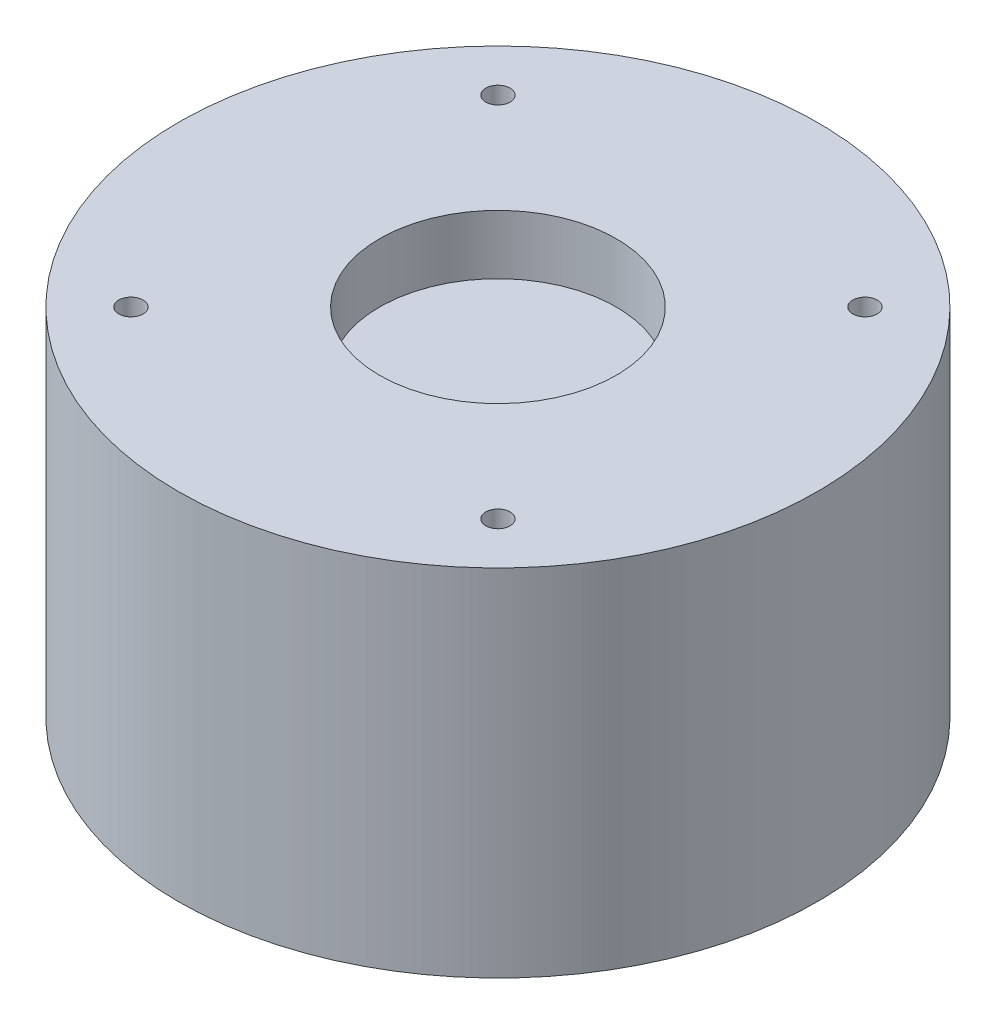
ISO-10303-21;
HEADER;
FILE_DESCRIPTION(('STEP AP214'),'2;1');
FILE_NAME('part.step','',(''),(''),'','','');
FILE_SCHEMA(('AUTOMOTIVE_DESIGN { 1 0 10303 214 1 1 1 1 }'));
ENDSEC;
DATA;
#1=APPLICATION_CONTEXT('core data for automotive mechanical design processes');
#2=APPLICATION_PROTOCOL_DEFINITION('international standard','automotive_design',2000,#1);
#3=PRODUCT_CONTEXT('',#1,'mechanical');
#4=PRODUCT('Part','Part','',(#3));
#5=PRODUCT_RELATED_PRODUCT_CATEGORY('part','',(#4));
#6=PRODUCT_DEFINITION_FORMATION('','',#4);
#7=PRODUCT_DEFINITION_CONTEXT('part definition',#1,'design');
#8=PRODUCT_DEFINITION('design','',#6,#7);
#9=PRODUCT_DEFINITION_SHAPE('','',#8);
#10=(LENGTH_UNIT() NAMED_UNIT(*) SI_UNIT(.MILLI.,.METRE.));
#11=(NAMED_UNIT(*) PLANE_ANGLE_UNIT() SI_UNIT($,.RADIAN.));
#12=(NAMED_UNIT(*) SI_UNIT($,.STERADIAN.) SOLID_ANGLE_UNIT());
#13=UNCERTAINTY_MEASURE_WITH_UNIT(LENGTH_MEASURE(1.E-05),#10,'distance_accuracy_value','');
#14=(GEOMETRIC_REPRESENTATION_CONTEXT(3) GLOBAL_UNCERTAINTY_ASSIGNED_CONTEXT((#13)) GLOBAL_UNIT_ASSIGNED_CONTEXT((#10,
#11,#12)) REPRESENTATION_CONTEXT('',''));
#15=CARTESIAN_POINT('',(0.,0.,0.));
#16=DIRECTION('',(0.,0.,1.));
#17=DIRECTION('',(1.,0.,0.));
#18=AXIS2_PLACEMENT_3D('',#15,#16,#17);
#19=CARTESIAN_POINT('',(0.,30.,0.));
#20=DIRECTION('',(0.,-1.,0.));
#21=DIRECTION('',(0.,0.,-1.));
#22=AXIS2_PLACEMENT_3D('',#19,#20,#21);
#23=CYLINDRICAL_SURFACE('',#22,27.);
#24=CARTESIAN_POINT('',(0.,30.,0.));
#25=DIRECTION('',(0.,1.,0.));
#26=DIRECTION('',(0.,0.,1.));
#27=AXIS2_PLACEMENT_3D('',#24,#25,#26);
#28=CIRCLE('',#27,27.);
#29=CARTESIAN_POINT('',(0.,30.,27.));
#30=VERTEX_POINT('',#29);
#31=EDGE_CURVE('E10',#30,#30,#28,.T.);
#32=ORIENTED_EDGE('',*,*,#31,.F.);
#33=EDGE_LOOP('',(#32));
#34=FACE_BOUND('',#33,.T.);
#35=CARTESIAN_POINT('',(0.,0.,0.));
#36=DIRECTION('',(0.,1.,0.));
#37=DIRECTION('',(0.,0.,1.));
#38=AXIS2_PLACEMENT_3D('',#35,#36,#37);
#39=CIRCLE('',#38,27.);
#40=CARTESIAN_POINT('',(0.,0.,27.));
#41=VERTEX_POINT('',#40);
#42=EDGE_CURVE('E44',#41,#41,#39,.T.);
#43=ORIENTED_EDGE('',*,*,#42,.T.);
#44=EDGE_LOOP('',(#43));
#45=FACE_BOUND('',#44,.T.);
#46=ADVANCED_FACE('F41',(#34,#45),#23,.T.);
#47=CARTESIAN_POINT('',(0.,30.,0.));
#48=DIRECTION('',(0.,1.,0.));
#49=DIRECTION('',(0.,0.,1.));
#50=AXIS2_PLACEMENT_3D('',#47,#48,#49);
#51=PLANE('',#50);
#52=CARTESIAN_POINT('',(0.,30.,0.));
#53=DIRECTION('',(0.,1.,0.));
#54=DIRECTION('',(0.,0.,1.));
#55=AXIS2_PLACEMENT_3D('',#52,#53,#54);
#56=CIRCLE('',#55,10.);
#57=CARTESIAN_POINT('',(0.,30.,10.));
#58=VERTEX_POINT('',#57);
#59=EDGE_CURVE('E95',#58,#58,#56,.T.);
#60=ORIENTED_EDGE('',*,*,#59,.F.);
#61=EDGE_LOOP('',(#60));
#62=FACE_BOUND('',#61,.T.);
#63=CARTESIAN_POINT('',(-15.5,30.,-15.5));
#64=DIRECTION('',(0.,-1.,0.));
#65=DIRECTION('',(0.,0.,-1.));
#66=AXIS2_PLACEMENT_3D('',#63,#64,#65);
#67=CIRCLE('',#66,1.02499999999999);
#68=CARTESIAN_POINT('',(-15.5,30.,-16.525));
#69=VERTEX_POINT('',#68);
#70=EDGE_CURVE('E78',#69,#69,#67,.T.);
#71=ORIENTED_EDGE('',*,*,#70,.T.);
#72=EDGE_LOOP('',(#71));
#73=FACE_BOUND('',#72,.T.);
#74=CARTESIAN_POINT('',(15.5,30.,-15.5));
#75=DIRECTION('',(0.,-1.,0.));
#76=DIRECTION('',(0.,0.,-1.));
#77=AXIS2_PLACEMENT_3D('',#74,#75,#76);
#78=CIRCLE('',#77,1.02499999999999);
#79=CARTESIAN_POINT('',(15.5,30.,-16.525));
#80=VERTEX_POINT('',#79);
#81=EDGE_CURVE('E70',#80,#80,#78,.T.);
#82=ORIENTED_EDGE('',*,*,#81,.T.);
#83=EDGE_LOOP('',(#82));
#84=FACE_BOUND('',#83,.T.);
#85=CARTESIAN_POINT('',(15.5,30.,15.5));
#86=DIRECTION('',(0.,-1.,0.));
#87=DIRECTION('',(0.,0.,-1.));
#88=AXIS2_PLACEMENT_3D('',#85,#86,#87);
#89=CIRCLE('',#88,1.02499999999999);
#90=CARTESIAN_POINT('',(15.5,30.,14.475));
#91=VERTEX_POINT('',#90);
#92=EDGE_CURVE('E62',#91,#91,#89,.T.);
#93=ORIENTED_EDGE('',*,*,#92,.T.);
#94=EDGE_LOOP('',(#93));
#95=FACE_BOUND('',#94,.T.);
#96=CARTESIAN_POINT('',(-15.5,30.,15.5));
#97=DIRECTION('',(0.,-1.,0.));
#98=DIRECTION('',(0.,0.,-1.));
#99=AXIS2_PLACEMENT_3D('',#96,#97,#98);
#100=CIRCLE('',#99,1.02499999999999);
#101=CARTESIAN_POINT('',(-15.5,30.,14.475));
#102=VERTEX_POINT('',#101);
#103=EDGE_CURVE('E53',#102,#102,#100,.T.);
#104=ORIENTED_EDGE('',*,*,#103,.T.);
#105=EDGE_LOOP('',(#104));
#106=FACE_BOUND('',#105,.T.);
#107=ORIENTED_EDGE('',*,*,#31,.T.);
#108=EDGE_LOOP('',(#107));
#109=FACE_BOUND('',#108,.T.);
#110=ADVANCED_FACE('F112',(#62,#73,#84,#95,#106,#109),#51,.T.);
#111=CARTESIAN_POINT('',(0.,0.,0.));
#112=DIRECTION('',(0.,1.,0.));
#113=DIRECTION('',(0.,0.,1.));
#114=AXIS2_PLACEMENT_3D('',#111,#112,#113);
#115=PLANE('',#114);
#116=CARTESIAN_POINT('',(0.,0.,0.));
#117=DIRECTION('',(0.,-1.,0.));
#118=DIRECTION('',(0.,0.,-1.));
#119=AXIS2_PLACEMENT_3D('',#116,#117,#118);
#120=CIRCLE('',#119,2.5);
#121=CARTESIAN_POINT('',(0.,0.,-2.5));
#122=VERTEX_POINT('',#121);
#123=EDGE_CURVE('E87',#122,#122,#120,.T.);
#124=ORIENTED_EDGE('',*,*,#123,.F.);
#125=EDGE_LOOP('',(#124));
#126=FACE_BOUND('',#125,.T.);
#127=CARTESIAN_POINT('',(-15.5,0.,-15.5));
#128=DIRECTION('',(0.,-1.,0.));
#129=DIRECTION('',(0.,0.,-1.));
#130=AXIS2_PLACEMENT_3D('',#127,#128,#129);
#131=CIRCLE('',#130,1.025);
#132=CARTESIAN_POINT('',(-15.5,0.,-16.525));
#133=VERTEX_POINT('',#132);
#134=EDGE_CURVE('E82',#133,#133,#131,.T.);
#135=ORIENTED_EDGE('',*,*,#134,.F.);
#136=EDGE_LOOP('',(#135));
#137=FACE_BOUND('',#136,.T.);
#138=CARTESIAN_POINT('',(15.5,0.,-15.5));
#139=DIRECTION('',(0.,-1.,0.));
#140=DIRECTION('',(0.,0.,-1.));
#141=AXIS2_PLACEMENT_3D('',#138,#139,#140);
#142=CIRCLE('',#141,1.025);
#143=CARTESIAN_POINT('',(15.5,0.,-16.525));
#144=VERTEX_POINT('',#143);
#145=EDGE_CURVE('E74',#144,#144,#142,.T.);
#146=ORIENTED_EDGE('',*,*,#145,.F.);
#147=EDGE_LOOP('',(#146));
#148=FACE_BOUND('',#147,.T.);
#149=CARTESIAN_POINT('',(15.5,0.,15.5));
#150=DIRECTION('',(0.,-1.,0.));
#151=DIRECTION('',(0.,0.,-1.));
#152=AXIS2_PLACEMENT_3D('',#149,#150,#151);
#153=CIRCLE('',#152,1.025);
#154=CARTESIAN_POINT('',(15.5,0.,14.475));
#155=VERTEX_POINT('',#154);
#156=EDGE_CURVE('E66',#155,#155,#153,.T.);
#157=ORIENTED_EDGE('',*,*,#156,.F.);
#158=EDGE_LOOP('',(#157));
#159=FACE_BOUND('',#158,.T.);
#160=CARTESIAN_POINT('',(-15.5,0.,15.5));
#161=DIRECTION('',(0.,-1.,0.));
#162=DIRECTION('',(0.,0.,-1.));
#163=AXIS2_PLACEMENT_3D('',#160,#161,#162);
#164=CIRCLE('',#163,1.025);
#165=CARTESIAN_POINT('',(-15.5,0.,14.475));
#166=VERTEX_POINT('',#165);
#167=EDGE_CURVE('E58',#166,#166,#164,.T.);
#168=ORIENTED_EDGE('',*,*,#167,.F.);
#169=EDGE_LOOP('',(#168));
#170=FACE_BOUND('',#169,.T.);
#171=ORIENTED_EDGE('',*,*,#42,.F.);
#172=EDGE_LOOP('',(#171));
#173=FACE_BOUND('',#172,.T.);
#174=ADVANCED_FACE('F115',(#126,#137,#148,#159,#170,#173),#115,.F.);
#175=CARTESIAN_POINT('',(-15.5,0.,15.5));
#176=DIRECTION('',(0.,-1.,0.));
#177=DIRECTION('',(0.,0.,-1.));
#178=AXIS2_PLACEMENT_3D('',#175,#176,#177);
#179=CYLINDRICAL_SURFACE('',#178,1.02499999999999);
#180=ORIENTED_EDGE('',*,*,#103,.F.);
#181=EDGE_LOOP('',(#180));
#182=FACE_BOUND('',#181,.T.);
#183=ORIENTED_EDGE('',*,*,#167,.T.);
#184=EDGE_LOOP('',(#183));
#185=FACE_BOUND('',#184,.T.);
#186=ADVANCED_FACE('F125',(#182,#185),#179,.F.);
#187=CARTESIAN_POINT('',(15.5,0.,15.5));
#188=DIRECTION('',(0.,-1.,0.));
#189=DIRECTION('',(0.,0.,-1.));
#190=AXIS2_PLACEMENT_3D('',#187,#188,#189);
#191=CYLINDRICAL_SURFACE('',#190,1.02499999999999);
#192=ORIENTED_EDGE('',*,*,#92,.F.);
#193=EDGE_LOOP('',(#192));
#194=FACE_BOUND('',#193,.T.);
#195=ORIENTED_EDGE('',*,*,#156,.T.);
#196=EDGE_LOOP('',(#195));
#197=FACE_BOUND('',#196,.T.);
#198=ADVANCED_FACE('F128',(#194,#197),#191,.F.);
#199=CARTESIAN_POINT('',(15.5,0.,-15.5));
#200=DIRECTION('',(0.,-1.,0.));
#201=DIRECTION('',(0.,0.,-1.));
#202=AXIS2_PLACEMENT_3D('',#199,#200,#201);
#203=CYLINDRICAL_SURFACE('',#202,1.02499999999999);
#204=ORIENTED_EDGE('',*,*,#81,.F.);
#205=EDGE_LOOP('',(#204));
#206=FACE_BOUND('',#205,.T.);
#207=ORIENTED_EDGE('',*,*,#145,.T.);
#208=EDGE_LOOP('',(#207));
#209=FACE_BOUND('',#208,.T.);
#210=ADVANCED_FACE('F164',(#206,#209),#203,.F.);
#211=CARTESIAN_POINT('',(-15.5,0.,-15.5));
#212=DIRECTION('',(0.,-1.,0.));
#213=DIRECTION('',(0.,0.,-1.));
#214=AXIS2_PLACEMENT_3D('',#211,#212,#213);
#215=CYLINDRICAL_SURFACE('',#214,1.02499999999999);
#216=ORIENTED_EDGE('',*,*,#70,.F.);
#217=EDGE_LOOP('',(#216));
#218=FACE_BOUND('',#217,.T.);
#219=ORIENTED_EDGE('',*,*,#134,.T.);
#220=EDGE_LOOP('',(#219));
#221=FACE_BOUND('',#220,.T.);
#222=ADVANCED_FACE('F172',(#218,#221),#215,.F.);
#223=CARTESIAN_POINT('',(0.,24.,0.));
#224=DIRECTION('',(0.,-1.,0.));
#225=DIRECTION('',(0.,0.,-1.));
#226=AXIS2_PLACEMENT_3D('',#223,#224,#225);
#227=CYLINDRICAL_SURFACE('',#226,2.5);
#228=CARTESIAN_POINT('',(0.,24.,0.));
#229=DIRECTION('',(0.,-1.,0.));
#230=DIRECTION('',(0.,0.,-1.));
#231=AXIS2_PLACEMENT_3D('',#228,#229,#230);
#232=CIRCLE('',#231,2.5);
#233=CARTESIAN_POINT('',(0.,24.,-2.5));
#234=VERTEX_POINT('',#233);
#235=EDGE_CURVE('E86',#234,#234,#232,.T.);
#236=ORIENTED_EDGE('',*,*,#235,.F.);
#237=EDGE_LOOP('',(#236));
#238=FACE_BOUND('',#237,.T.);
#239=ORIENTED_EDGE('',*,*,#123,.T.);
#240=EDGE_LOOP('',(#239));
#241=FACE_BOUND('',#240,.T.);
#242=ADVANCED_FACE('F180',(#238,#241),#227,.F.);
#243=CARTESIAN_POINT('',(0.,24.,0.));
#244=DIRECTION('',(0.,-1.,0.));
#245=DIRECTION('',(0.,0.,-1.));
#246=AXIS2_PLACEMENT_3D('',#243,#244,#245);
#247=PLANE('',#246);
#248=ORIENTED_EDGE('',*,*,#235,.T.);
#249=EDGE_LOOP('',(#248));
#250=FACE_BOUND('',#249,.T.);
#251=ADVANCED_FACE('F108',(#250),#247,.T.);
#252=CARTESIAN_POINT('',(0.,25.,0.));
#253=DIRECTION('',(0.,1.,0.));
#254=DIRECTION('',(0.,0.,1.));
#255=AXIS2_PLACEMENT_3D('',#252,#253,#254);
#256=CYLINDRICAL_SURFACE('',#255,10.);
#257=CARTESIAN_POINT('',(0.,25.,0.));
#258=DIRECTION('',(0.,1.,0.));
#259=DIRECTION('',(0.,0.,1.));
#260=AXIS2_PLACEMENT_3D('',#257,#258,#259);
#261=CIRCLE('',#260,10.);
#262=CARTESIAN_POINT('',(0.,25.,10.));
#263=VERTEX_POINT('',#262);
#264=EDGE_CURVE('E91',#263,#263,#261,.T.);
#265=ORIENTED_EDGE('',*,*,#264,.F.);
#266=EDGE_LOOP('',(#265));
#267=FACE_BOUND('',#266,.T.);
#268=ORIENTED_EDGE('',*,*,#59,.T.);
#269=EDGE_LOOP('',(#268));
#270=FACE_BOUND('',#269,.T.);
#271=ADVANCED_FACE('F105',(#267,#270),#256,.F.);
#272=CARTESIAN_POINT('',(0.,25.,0.));
#273=DIRECTION('',(0.,1.,0.));
#274=DIRECTION('',(0.,0.,1.));
#275=AXIS2_PLACEMENT_3D('',#272,#273,#274);
#276=PLANE('',#275);
#277=ORIENTED_EDGE('',*,*,#264,.T.);
#278=EDGE_LOOP('',(#277));
#279=FACE_BOUND('',#278,.T.);
#280=ADVANCED_FACE('F103',(#279),#276,.T.);
#281=CLOSED_SHELL('',(#46,#110,#174,#186,#198,#210,#222,#242,#251,#271,#280));
#282=MANIFOLD_SOLID_BREP('B2',#281);
#283=ADVANCED_BREP_SHAPE_REPRESENTATION('',(#18,#282),#14);
#284=SHAPE_DEFINITION_REPRESENTATION(#9,#283);
ENDSEC;
END-ISO-10303-21;
